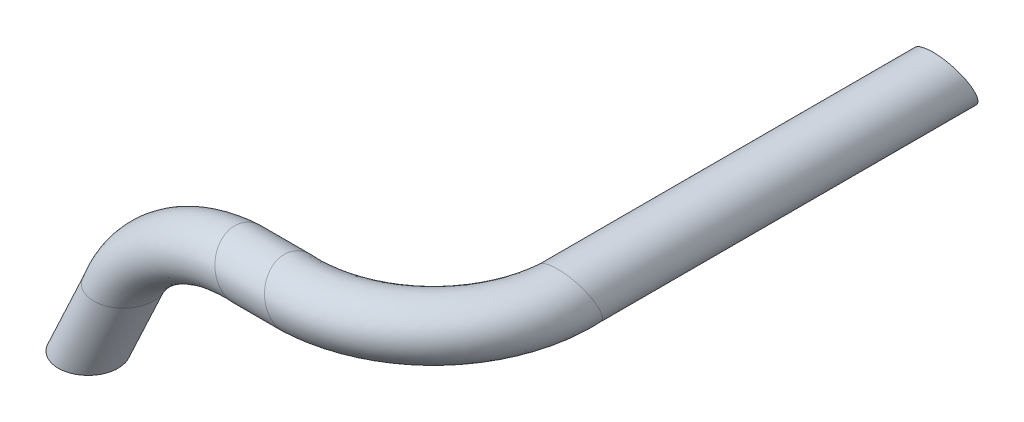
ISO-10303-21;
HEADER;
FILE_DESCRIPTION(('STEP AP214'),'2;1');
FILE_NAME('part.step','',(''),(''),'','','');
FILE_SCHEMA(('AUTOMOTIVE_DESIGN { 1 0 10303 214 1 1 1 1 }'));
ENDSEC;
DATA;
#1=APPLICATION_CONTEXT('core data for automotive mechanical design processes');
#2=APPLICATION_PROTOCOL_DEFINITION('international standard','automotive_design',2000,#1);
#3=PRODUCT_CONTEXT('',#1,'mechanical');
#4=PRODUCT('Part','Part','',(#3));
#5=PRODUCT_RELATED_PRODUCT_CATEGORY('part','',(#4));
#6=PRODUCT_DEFINITION_FORMATION('','',#4);
#7=PRODUCT_DEFINITION_CONTEXT('part definition',#1,'design');
#8=PRODUCT_DEFINITION('design','',#6,#7);
#9=PRODUCT_DEFINITION_SHAPE('','',#8);
#10=(LENGTH_UNIT() NAMED_UNIT(*) SI_UNIT(.MILLI.,.METRE.));
#11=(NAMED_UNIT(*) PLANE_ANGLE_UNIT() SI_UNIT($,.RADIAN.));
#12=(NAMED_UNIT(*) SI_UNIT($,.STERADIAN.) SOLID_ANGLE_UNIT());
#13=UNCERTAINTY_MEASURE_WITH_UNIT(LENGTH_MEASURE(1.E-05),#10,'distance_accuracy_value','');
#14=(GEOMETRIC_REPRESENTATION_CONTEXT(3) GLOBAL_UNCERTAINTY_ASSIGNED_CONTEXT((#13)) GLOBAL_UNIT_ASSIGNED_CONTEXT((#10,
#11,#12)) REPRESENTATION_CONTEXT('',''));
#15=CARTESIAN_POINT('',(0.,0.,0.));
#16=DIRECTION('',(0.,0.,1.));
#17=DIRECTION('',(1.,0.,0.));
#18=AXIS2_PLACEMENT_3D('',#15,#16,#17);
#19=CARTESIAN_POINT('',(20.226182617407,9.06307787036649,-8.));
#20=DIRECTION('',(0.,0.422618261740701,-0.906307787036649));
#21=DIRECTION('',(1.,0.,0.));
#22=AXIS2_PLACEMENT_3D('',#19,#20,#21);
#23=CIRCLE('',#22,1.75);
#24=DIRECTION('',(0.,0.,-1.));
#25=VECTOR('',#24,1.);
#26=SURFACE_OF_LINEAR_EXTRUSION('',#23,#25);
#27=CARTESIAN_POINT('',(21.976182617407,9.06307787036649,-8.));
#28=VERTEX_POINT('',#27);
#29=EDGE_CURVE('E37',#28,#28,#23,.T.);
#30=ORIENTED_EDGE('',*,*,#29,.T.);
#31=EDGE_LOOP('',(#30));
#32=FACE_BOUND('',#31,.T.);
#33=CARTESIAN_POINT('',(20.226182617407,9.0630778703665,-30.));
#34=DIRECTION('',(0.,0.422618261740701,-0.906307787036649));
#35=DIRECTION('',(1.,0.,0.));
#36=AXIS2_PLACEMENT_3D('',#33,#34,#35);
#37=CIRCLE('',#36,1.75);
#38=CARTESIAN_POINT('',(21.976182617407,9.0630778703665,-30.));
#39=VERTEX_POINT('',#38);
#40=EDGE_CURVE('E10',#39,#39,#37,.T.);
#41=ORIENTED_EDGE('',*,*,#40,.F.);
#42=EDGE_LOOP('',(#41));
#43=FACE_BOUND('',#42,.T.);
#44=ADVANCED_FACE('F31',(#32,#43),#26,.T.);
#45=CARTESIAN_POINT('',(12.226182617407,9.0630778703665,0.));
#46=DIRECTION('',(0.90630778703665,0.4226182617407,0.));
#47=DIRECTION('',(0.,0.,1.));
#48=AXIS2_PLACEMENT_3D('',#45,#46,#47);
#49=CIRCLE('',#48,1.75);
#50=CARTESIAN_POINT('',(12.226182617407,9.0630778703665,-8.));
#51=DIRECTION('',(0.,1.,0.));
#52=AXIS1_PLACEMENT('',#50,#51);
#53=SURFACE_OF_REVOLUTION('',#49,#52);
#54=CARTESIAN_POINT('',(12.226182617407,9.0630778703665,1.75));
#55=VERTEX_POINT('',#54);
#56=EDGE_CURVE('E41',#55,#55,#49,.T.);
#57=ORIENTED_EDGE('',*,*,#56,.T.);
#58=EDGE_LOOP('',(#57));
#59=FACE_BOUND('',#58,.T.);
#60=ORIENTED_EDGE('',*,*,#29,.F.);
#61=EDGE_LOOP('',(#60));
#62=FACE_BOUND('',#61,.T.);
#63=ADVANCED_FACE('F52',(#59,#62),#53,.F.);
#64=CARTESIAN_POINT('',(9.32274470386694,9.06307787036649,0.));
#65=DIRECTION('',(0.90630778703665,0.4226182617407,0.));
#66=DIRECTION('',(0.,0.,1.));
#67=AXIS2_PLACEMENT_3D('',#64,#65,#66);
#68=CIRCLE('',#67,1.75);
#69=DIRECTION('',(1.,0.,0.));
#70=VECTOR('',#69,1.);
#71=SURFACE_OF_LINEAR_EXTRUSION('',#68,#70);
#72=CARTESIAN_POINT('',(9.32274470386694,9.06307787036649,1.75));
#73=VERTEX_POINT('',#72);
#74=EDGE_CURVE('E45',#73,#73,#68,.T.);
#75=ORIENTED_EDGE('',*,*,#74,.T.);
#76=EDGE_LOOP('',(#75));
#77=FACE_BOUND('',#76,.T.);
#78=ORIENTED_EDGE('',*,*,#56,.F.);
#79=EDGE_LOOP('',(#78));
#80=FACE_BOUND('',#79,.T.);
#81=ADVANCED_FACE('F55',(#77,#80),#71,.T.);
#82=CARTESIAN_POINT('',(2.07228240757375,4.4440239642921,0.));
#83=DIRECTION('',(0.,1.,0.));
#84=DIRECTION('',(0.,0.,1.));
#85=AXIS2_PLACEMENT_3D('',#82,#83,#84);
#86=CIRCLE('',#85,1.75);
#87=CARTESIAN_POINT('',(9.32274470386694,1.0630778703665,0.));
#88=DIRECTION('',(0.,0.,-1.));
#89=AXIS1_PLACEMENT('',#87,#88);
#90=SURFACE_OF_REVOLUTION('',#86,#89);
#91=CARTESIAN_POINT('',(2.07228240757375,4.4440239642921,1.75));
#92=VERTEX_POINT('',#91);
#93=EDGE_CURVE('E67',#92,#92,#86,.T.);
#94=ORIENTED_EDGE('',*,*,#93,.T.);
#95=EDGE_LOOP('',(#94));
#96=FACE_BOUND('',#95,.T.);
#97=ORIENTED_EDGE('',*,*,#74,.F.);
#98=EDGE_LOOP('',(#97));
#99=FACE_BOUND('',#98,.T.);
#100=ADVANCED_FACE('F59',(#96,#99),#90,.F.);
#101=DIRECTION('',(-0.4226182617407,-0.906307787036649,0.));
#102=VECTOR('',#101,1.);
#103=SURFACE_OF_LINEAR_EXTRUSION('',#86,#102);
#104=ORIENTED_EDGE('',*,*,#93,.F.);
#105=EDGE_LOOP('',(#104));
#106=FACE_BOUND('',#105,.T.);
#107=CARTESIAN_POINT('',(0.,0.,0.));
#108=DIRECTION('',(0.,1.,0.));
#109=DIRECTION('',(0.,0.,1.));
#110=AXIS2_PLACEMENT_3D('',#107,#108,#109);
#111=CIRCLE('',#110,1.75);
#112=CARTESIAN_POINT('',(0.,0.,1.75));
#113=VERTEX_POINT('',#112);
#114=EDGE_CURVE('E70',#113,#113,#111,.T.);
#115=ORIENTED_EDGE('',*,*,#114,.T.);
#116=EDGE_LOOP('',(#115));
#117=FACE_BOUND('',#116,.T.);
#118=ADVANCED_FACE('F64',(#106,#117),#103,.F.);
#119=CARTESIAN_POINT('',(20.226182617407,9.0630778703665,-30.));
#120=DIRECTION('',(0.,0.422618261740701,-0.906307787036649));
#121=DIRECTION('',(1.,0.,0.));
#122=AXIS2_PLACEMENT_3D('',#119,#120,#121);
#123=PLANE('',#122);
#124=ORIENTED_EDGE('',*,*,#40,.T.);
#125=EDGE_LOOP('',(#124));
#126=FACE_BOUND('',#125,.T.);
#127=ADVANCED_FACE('F78',(#126),#123,.T.);
#128=CARTESIAN_POINT('',(0.,0.,0.));
#129=DIRECTION('',(0.,1.,0.));
#130=DIRECTION('',(0.,0.,1.));
#131=AXIS2_PLACEMENT_3D('',#128,#129,#130);
#132=PLANE('',#131);
#133=ORIENTED_EDGE('',*,*,#114,.F.);
#134=EDGE_LOOP('',(#133));
#135=FACE_BOUND('',#134,.T.);
#136=ADVANCED_FACE('F76',(#135),#132,.F.);
#137=CLOSED_SHELL('',(#44,#63,#81,#100,#118,#127,#136));
#138=MANIFOLD_SOLID_BREP('B2',#137);
#139=ADVANCED_BREP_SHAPE_REPRESENTATION('',(#18,#138),#14);
#140=SHAPE_DEFINITION_REPRESENTATION(#9,#139);
ENDSEC;
END-ISO-10303-21;
